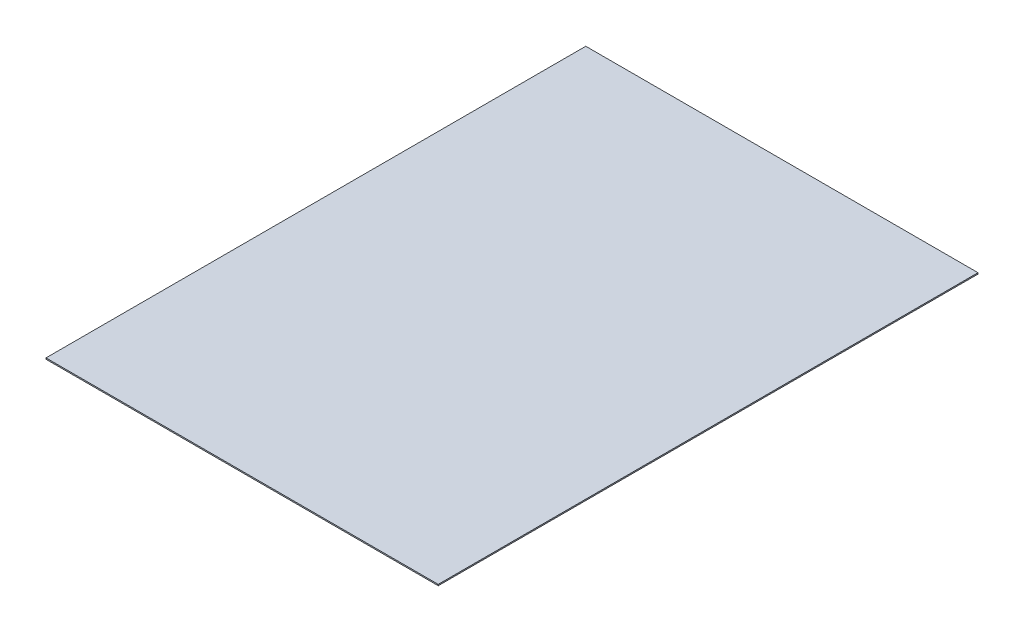
ISO-10303-21;
HEADER;
FILE_DESCRIPTION(('STEP AP214'),'2;1');
FILE_NAME('part.step','',(''),(''),'','','');
FILE_SCHEMA(('AUTOMOTIVE_DESIGN { 1 0 10303 214 1 1 1 1 }'));
ENDSEC;
DATA;
#1=APPLICATION_CONTEXT('core data for automotive mechanical design processes');
#2=APPLICATION_PROTOCOL_DEFINITION('international standard','automotive_design',2000,#1);
#3=PRODUCT_CONTEXT('',#1,'mechanical');
#4=PRODUCT('Part','Part','',(#3));
#5=PRODUCT_RELATED_PRODUCT_CATEGORY('part','',(#4));
#6=PRODUCT_DEFINITION_FORMATION('','',#4);
#7=PRODUCT_DEFINITION_CONTEXT('part definition',#1,'design');
#8=PRODUCT_DEFINITION('design','',#6,#7);
#9=PRODUCT_DEFINITION_SHAPE('','',#8);
#10=(LENGTH_UNIT() NAMED_UNIT(*) SI_UNIT(.MILLI.,.METRE.));
#11=(NAMED_UNIT(*) PLANE_ANGLE_UNIT() SI_UNIT($,.RADIAN.));
#12=(NAMED_UNIT(*) SI_UNIT($,.STERADIAN.) SOLID_ANGLE_UNIT());
#13=UNCERTAINTY_MEASURE_WITH_UNIT(LENGTH_MEASURE(1.E-05),#10,'distance_accuracy_value','');
#14=(GEOMETRIC_REPRESENTATION_CONTEXT(3) GLOBAL_UNCERTAINTY_ASSIGNED_CONTEXT((#13)) GLOBAL_UNIT_ASSIGNED_CONTEXT((#10,
#11,#12)) REPRESENTATION_CONTEXT('',''));
#15=CARTESIAN_POINT('',(0.,0.,0.));
#16=DIRECTION('',(0.,0.,1.));
#17=DIRECTION('',(1.,0.,0.));
#18=AXIS2_PLACEMENT_3D('',#15,#16,#17);
#19=CARTESIAN_POINT('',(0.,2.9,0.));
#20=DIRECTION('',(1.,0.,0.));
#21=DIRECTION('',(0.,0.,-1.));
#22=AXIS2_PLACEMENT_3D('',#19,#20,#21);
#23=PLANE('',#22);
#24=DIRECTION('',(0.,0.,1.));
#25=VECTOR('',#24,1.);
#26=CARTESIAN_POINT('',(0.,0.,0.));
#27=LINE('',#26,#25);
#28=CARTESIAN_POINT('',(0.,0.,0.));
#29=VERTEX_POINT('',#28);
#30=CARTESIAN_POINT('',(1.5408506026872E-13,0.,1258.2));
#31=VERTEX_POINT('',#30);
#32=EDGE_CURVE('E98',#29,#31,#27,.T.);
#33=ORIENTED_EDGE('',*,*,#32,.T.);
#34=DIRECTION('',(0.,-1.,0.));
#35=VECTOR('',#34,1.);
#36=CARTESIAN_POINT('',(1.5408506026872E-13,2.9,1258.2));
#37=LINE('',#36,#35);
#38=CARTESIAN_POINT('',(1.5408506026872E-13,2.9,1258.2));
#39=VERTEX_POINT('',#38);
#40=EDGE_CURVE('E11',#39,#31,#37,.T.);
#41=ORIENTED_EDGE('',*,*,#40,.F.);
#42=DIRECTION('',(0.,0.,1.));
#43=VECTOR('',#42,1.);
#44=CARTESIAN_POINT('',(0.,2.9,0.));
#45=LINE('',#44,#43);
#46=CARTESIAN_POINT('',(0.,2.9,0.));
#47=VERTEX_POINT('',#46);
#48=EDGE_CURVE('E86',#47,#39,#45,.T.);
#49=ORIENTED_EDGE('',*,*,#48,.F.);
#50=DIRECTION('',(0.,-1.,0.));
#51=VECTOR('',#50,1.);
#52=CARTESIAN_POINT('',(0.,2.9,0.));
#53=LINE('',#52,#51);
#54=EDGE_CURVE('E94',#47,#29,#53,.T.);
#55=ORIENTED_EDGE('',*,*,#54,.T.);
#56=EDGE_LOOP('',(#33,#41,#49,#55));
#57=FACE_BOUND('',#56,.T.);
#58=ADVANCED_FACE('F35',(#57),#23,.F.);
#59=CARTESIAN_POINT('',(1.5408506026872E-13,2.9,1258.2));
#60=DIRECTION('',(0.,0.,-1.));
#61=DIRECTION('',(-1.,0.,0.));
#62=AXIS2_PLACEMENT_3D('',#59,#60,#61);
#63=PLANE('',#62);
#64=DIRECTION('',(1.,0.,0.));
#65=VECTOR('',#64,1.);
#66=CARTESIAN_POINT('',(1.5408506026872E-13,0.,1258.2));
#67=LINE('',#66,#65);
#68=CARTESIAN_POINT('',(914.3,0.,1258.2));
#69=VERTEX_POINT('',#68);
#70=EDGE_CURVE('E90',#31,#69,#67,.T.);
#71=ORIENTED_EDGE('',*,*,#70,.T.);
#72=DIRECTION('',(0.,-1.,0.));
#73=VECTOR('',#72,1.);
#74=CARTESIAN_POINT('',(914.3,2.9,1258.2));
#75=LINE('',#74,#73);
#76=CARTESIAN_POINT('',(914.3,2.9,1258.2));
#77=VERTEX_POINT('',#76);
#78=EDGE_CURVE('E43',#77,#69,#75,.T.);
#79=ORIENTED_EDGE('',*,*,#78,.F.);
#80=DIRECTION('',(1.,0.,0.));
#81=VECTOR('',#80,1.);
#82=CARTESIAN_POINT('',(1.5408506026872E-13,2.9,1258.2));
#83=LINE('',#82,#81);
#84=EDGE_CURVE('E81',#39,#77,#83,.T.);
#85=ORIENTED_EDGE('',*,*,#84,.F.);
#86=ORIENTED_EDGE('',*,*,#40,.T.);
#87=EDGE_LOOP('',(#71,#79,#85,#86));
#88=FACE_BOUND('',#87,.T.);
#89=ADVANCED_FACE('F89',(#88),#63,.F.);
#90=CARTESIAN_POINT('',(914.3,2.9,0.));
#91=DIRECTION('',(-1.,0.,0.));
#92=DIRECTION('',(0.,0.,1.));
#93=AXIS2_PLACEMENT_3D('',#90,#91,#92);
#94=PLANE('',#93);
#95=DIRECTION('',(0.,0.,-1.));
#96=VECTOR('',#95,1.);
#97=CARTESIAN_POINT('',(914.3,0.,0.));
#98=LINE('',#97,#96);
#99=CARTESIAN_POINT('',(914.3,0.,0.));
#100=VERTEX_POINT('',#99);
#101=EDGE_CURVE('E68',#69,#100,#98,.T.);
#102=ORIENTED_EDGE('',*,*,#101,.T.);
#103=DIRECTION('',(0.,-1.,0.));
#104=VECTOR('',#103,1.);
#105=CARTESIAN_POINT('',(914.3,2.9,0.));
#106=LINE('',#105,#104);
#107=CARTESIAN_POINT('',(914.3,2.9,0.));
#108=VERTEX_POINT('',#107);
#109=EDGE_CURVE('E91',#108,#100,#106,.T.);
#110=ORIENTED_EDGE('',*,*,#109,.F.);
#111=DIRECTION('',(0.,0.,-1.));
#112=VECTOR('',#111,1.);
#113=CARTESIAN_POINT('',(914.3,2.9,0.));
#114=LINE('',#113,#112);
#115=EDGE_CURVE('E84',#77,#108,#114,.T.);
#116=ORIENTED_EDGE('',*,*,#115,.F.);
#117=ORIENTED_EDGE('',*,*,#78,.T.);
#118=EDGE_LOOP('',(#102,#110,#116,#117));
#119=FACE_BOUND('',#118,.T.);
#120=ADVANCED_FACE('F92',(#119),#94,.F.);
#121=CARTESIAN_POINT('',(0.,2.9,0.));
#122=DIRECTION('',(0.,0.,1.));
#123=DIRECTION('',(1.,0.,0.));
#124=AXIS2_PLACEMENT_3D('',#121,#122,#123);
#125=PLANE('',#124);
#126=DIRECTION('',(-1.,0.,0.));
#127=VECTOR('',#126,1.);
#128=CARTESIAN_POINT('',(0.,0.,0.));
#129=LINE('',#128,#127);
#130=EDGE_CURVE('E74',#100,#29,#129,.T.);
#131=ORIENTED_EDGE('',*,*,#130,.T.);
#132=ORIENTED_EDGE('',*,*,#54,.F.);
#133=DIRECTION('',(-1.,0.,0.));
#134=VECTOR('',#133,1.);
#135=CARTESIAN_POINT('',(0.,2.9,0.));
#136=LINE('',#135,#134);
#137=EDGE_CURVE('E51',#108,#47,#136,.T.);
#138=ORIENTED_EDGE('',*,*,#137,.F.);
#139=ORIENTED_EDGE('',*,*,#109,.T.);
#140=EDGE_LOOP('',(#131,#132,#138,#139));
#141=FACE_BOUND('',#140,.T.);
#142=ADVANCED_FACE('F105',(#141),#125,.F.);
#143=CARTESIAN_POINT('',(0.,2.9,0.));
#144=DIRECTION('',(0.,1.,0.));
#145=DIRECTION('',(0.,0.,1.));
#146=AXIS2_PLACEMENT_3D('',#143,#144,#145);
#147=PLANE('',#146);
#148=ORIENTED_EDGE('',*,*,#48,.T.);
#149=ORIENTED_EDGE('',*,*,#84,.T.);
#150=ORIENTED_EDGE('',*,*,#115,.T.);
#151=ORIENTED_EDGE('',*,*,#137,.T.);
#152=EDGE_LOOP('',(#148,#149,#150,#151));
#153=FACE_BOUND('',#152,.T.);
#154=ADVANCED_FACE('F82',(#153),#147,.T.);
#155=CARTESIAN_POINT('',(0.,0.,0.));
#156=DIRECTION('',(0.,1.,0.));
#157=DIRECTION('',(0.,0.,1.));
#158=AXIS2_PLACEMENT_3D('',#155,#156,#157);
#159=PLANE('',#158);
#160=ORIENTED_EDGE('',*,*,#32,.F.);
#161=ORIENTED_EDGE('',*,*,#130,.F.);
#162=ORIENTED_EDGE('',*,*,#101,.F.);
#163=ORIENTED_EDGE('',*,*,#70,.F.);
#164=EDGE_LOOP('',(#160,#161,#162,#163));
#165=FACE_BOUND('',#164,.T.);
#166=ADVANCED_FACE('F108',(#165),#159,.F.);
#167=CLOSED_SHELL('',(#58,#89,#120,#142,#154,#166));
#168=MANIFOLD_SOLID_BREP('B2',#167);
#169=ADVANCED_BREP_SHAPE_REPRESENTATION('',(#18,#168),#14);
#170=SHAPE_DEFINITION_REPRESENTATION(#9,#169);
ENDSEC;
END-ISO-10303-21;
